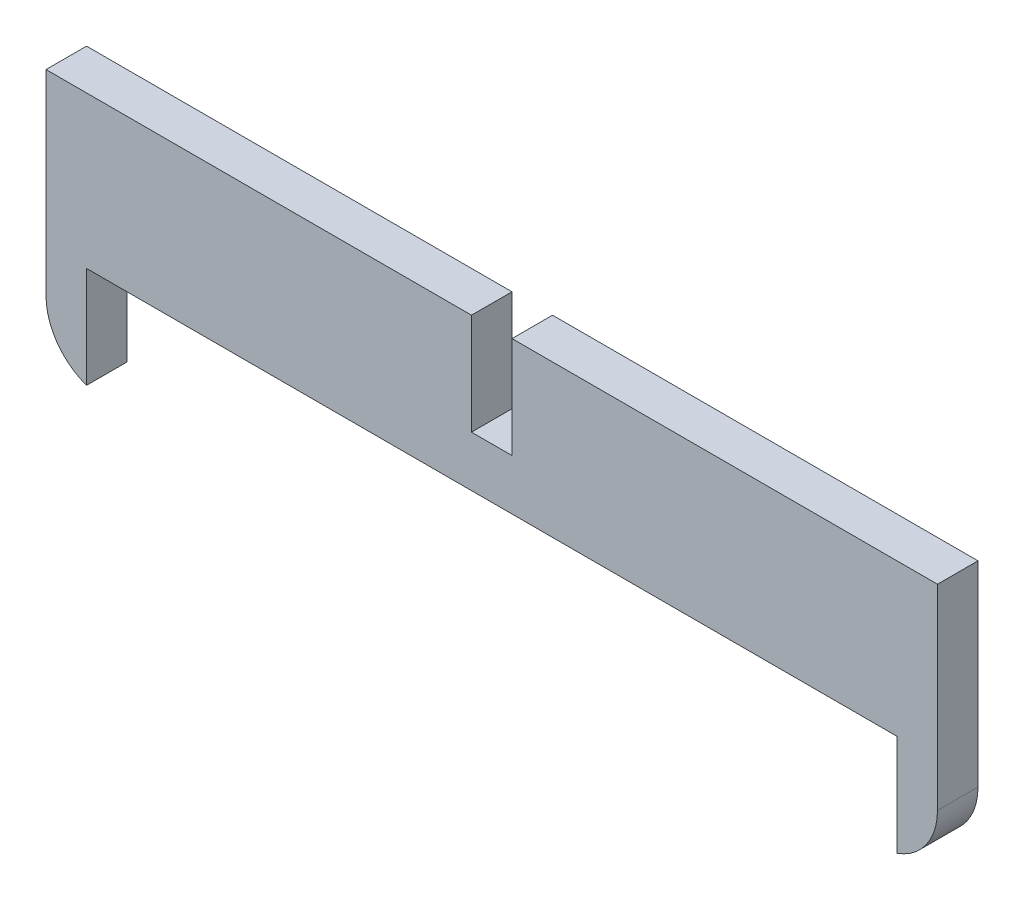
ISO-10303-21;
HEADER;
FILE_DESCRIPTION(('STEP AP214'),'2;1');
FILE_NAME('part.step','',(''),(''),'','','');
FILE_SCHEMA(('AUTOMOTIVE_DESIGN { 1 0 10303 214 1 1 1 1 }'));
ENDSEC;
DATA;
#1=APPLICATION_CONTEXT('core data for automotive mechanical design processes');
#2=APPLICATION_PROTOCOL_DEFINITION('international standard','automotive_design',2000,#1);
#3=PRODUCT_CONTEXT('',#1,'mechanical');
#4=PRODUCT('Part','Part','',(#3));
#5=PRODUCT_RELATED_PRODUCT_CATEGORY('part','',(#4));
#6=PRODUCT_DEFINITION_FORMATION('','',#4);
#7=PRODUCT_DEFINITION_CONTEXT('part definition',#1,'design');
#8=PRODUCT_DEFINITION('design','',#6,#7);
#9=PRODUCT_DEFINITION_SHAPE('','',#8);
#10=(LENGTH_UNIT() NAMED_UNIT(*) SI_UNIT(.MILLI.,.METRE.));
#11=(NAMED_UNIT(*) PLANE_ANGLE_UNIT() SI_UNIT($,.RADIAN.));
#12=(NAMED_UNIT(*) SI_UNIT($,.STERADIAN.) SOLID_ANGLE_UNIT());
#13=UNCERTAINTY_MEASURE_WITH_UNIT(LENGTH_MEASURE(1.E-05),#10,'distance_accuracy_value','');
#14=(GEOMETRIC_REPRESENTATION_CONTEXT(3) GLOBAL_UNCERTAINTY_ASSIGNED_CONTEXT((#13)) GLOBAL_UNIT_ASSIGNED_CONTEXT((#10,
#11,#12)) REPRESENTATION_CONTEXT('',''));
#15=CARTESIAN_POINT('',(0.,0.,0.));
#16=DIRECTION('',(0.,0.,1.));
#17=DIRECTION('',(1.,0.,0.));
#18=AXIS2_PLACEMENT_3D('',#15,#16,#17);
#19=CARTESIAN_POINT('',(-55.88,9.525,5.08));
#20=DIRECTION('',(0.,-1.,0.));
#21=DIRECTION('',(0.,0.,-1.));
#22=AXIS2_PLACEMENT_3D('',#19,#20,#21);
#23=PLANE('',#22);
#24=DIRECTION('',(-1.,0.,0.));
#25=VECTOR('',#24,1.);
#26=CARTESIAN_POINT('',(-55.88,9.525,0.));
#27=LINE('',#26,#25);
#28=CARTESIAN_POINT('',(55.88,9.525,0.));
#29=VERTEX_POINT('',#28);
#30=CARTESIAN_POINT('',(2.54,9.525,0.));
#31=VERTEX_POINT('',#30);
#32=EDGE_CURVE('E137',#29,#31,#27,.T.);
#33=ORIENTED_EDGE('',*,*,#32,.T.);
#34=DIRECTION('',(0.,0.,1.));
#35=VECTOR('',#34,1.);
#36=CARTESIAN_POINT('',(2.54,9.525,0.));
#37=LINE('',#36,#35);
#38=CARTESIAN_POINT('',(2.54,9.525,5.08));
#39=VERTEX_POINT('',#38);
#40=EDGE_CURVE('E121',#31,#39,#37,.T.);
#41=ORIENTED_EDGE('',*,*,#40,.T.);
#42=DIRECTION('',(-1.,0.,0.));
#43=VECTOR('',#42,1.);
#44=CARTESIAN_POINT('',(-55.88,9.525,5.08));
#45=LINE('',#44,#43);
#46=CARTESIAN_POINT('',(55.88,9.525,5.08));
#47=VERTEX_POINT('',#46);
#48=EDGE_CURVE('E211',#47,#39,#45,.T.);
#49=ORIENTED_EDGE('',*,*,#48,.F.);
#50=DIRECTION('',(0.,0.,-1.));
#51=VECTOR('',#50,1.);
#52=CARTESIAN_POINT('',(55.88,9.525,5.08));
#53=LINE('',#52,#51);
#54=EDGE_CURVE('E144',#47,#29,#53,.T.);
#55=ORIENTED_EDGE('',*,*,#54,.T.);
#56=EDGE_LOOP('',(#33,#41,#49,#55));
#57=FACE_BOUND('',#56,.T.);
#58=ADVANCED_FACE('F32',(#57),#23,.F.);
#59=CARTESIAN_POINT('',(-55.88,-9.525,5.08));
#60=DIRECTION('',(0.,1.,0.));
#61=DIRECTION('',(0.,0.,1.));
#62=AXIS2_PLACEMENT_3D('',#59,#60,#61);
#63=PLANE('',#62);
#64=DIRECTION('',(1.,0.,0.));
#65=VECTOR('',#64,1.);
#66=CARTESIAN_POINT('',(-55.88,-9.525,0.));
#67=LINE('',#66,#65);
#68=CARTESIAN_POINT('',(-50.8,-9.525,0.));
#69=VERTEX_POINT('',#68);
#70=CARTESIAN_POINT('',(50.8,-9.525,0.));
#71=VERTEX_POINT('',#70);
#72=EDGE_CURVE('E148',#69,#71,#67,.T.);
#73=ORIENTED_EDGE('',*,*,#72,.T.);
#74=DIRECTION('',(0.,0.,1.));
#75=VECTOR('',#74,1.);
#76=CARTESIAN_POINT('',(50.8,-9.525,5.08));
#77=LINE('',#76,#75);
#78=CARTESIAN_POINT('',(50.8,-9.525,5.08));
#79=VERTEX_POINT('',#78);
#80=EDGE_CURVE('E193',#71,#79,#77,.T.);
#81=ORIENTED_EDGE('',*,*,#80,.T.);
#82=DIRECTION('',(1.,0.,0.));
#83=VECTOR('',#82,1.);
#84=CARTESIAN_POINT('',(-55.88,-9.525,5.08));
#85=LINE('',#84,#83);
#86=CARTESIAN_POINT('',(-50.8,-9.525,5.08));
#87=VERTEX_POINT('',#86);
#88=EDGE_CURVE('E159',#87,#79,#85,.T.);
#89=ORIENTED_EDGE('',*,*,#88,.F.);
#90=DIRECTION('',(0.,0.,1.));
#91=VECTOR('',#90,1.);
#92=CARTESIAN_POINT('',(-50.8,-9.525,5.08));
#93=LINE('',#92,#91);
#94=EDGE_CURVE('E195',#69,#87,#93,.T.);
#95=ORIENTED_EDGE('',*,*,#94,.F.);
#96=EDGE_LOOP('',(#73,#81,#89,#95));
#97=FACE_BOUND('',#96,.T.);
#98=ADVANCED_FACE('F216',(#97),#63,.F.);
#99=CARTESIAN_POINT('',(55.88,-9.525,5.08));
#100=DIRECTION('',(-1.,0.,0.));
#101=DIRECTION('',(0.,0.,1.));
#102=AXIS2_PLACEMENT_3D('',#99,#100,#101);
#103=PLANE('',#102);
#104=DIRECTION('',(0.,1.,0.));
#105=VECTOR('',#104,1.);
#106=CARTESIAN_POINT('',(55.88,-9.525,5.08));
#107=LINE('',#106,#105);
#108=CARTESIAN_POINT('',(55.88,-15.0407951031447,5.08));
#109=VERTEX_POINT('',#108);
#110=EDGE_CURVE('E155',#109,#47,#107,.T.);
#111=ORIENTED_EDGE('',*,*,#110,.F.);
#112=DIRECTION('',(0.,0.,-1.));
#113=VECTOR('',#112,1.);
#114=CARTESIAN_POINT('',(55.88,-15.0407951031447,5.08));
#115=LINE('',#114,#113);
#116=CARTESIAN_POINT('',(55.88,-15.0407951031447,0.));
#117=VERTEX_POINT('',#116);
#118=EDGE_CURVE('E161',#109,#117,#115,.T.);
#119=ORIENTED_EDGE('',*,*,#118,.T.);
#120=DIRECTION('',(0.,1.,0.));
#121=VECTOR('',#120,1.);
#122=CARTESIAN_POINT('',(55.88,-9.525,0.));
#123=LINE('',#122,#121);
#124=EDGE_CURVE('E150',#117,#29,#123,.T.);
#125=ORIENTED_EDGE('',*,*,#124,.T.);
#126=ORIENTED_EDGE('',*,*,#54,.F.);
#127=EDGE_LOOP('',(#111,#119,#125,#126));
#128=FACE_BOUND('',#127,.T.);
#129=ADVANCED_FACE('F181',(#128),#103,.F.);
#130=CARTESIAN_POINT('',(-2.54,9.525,5.08));
#131=VERTEX_POINT('',#130);
#132=CARTESIAN_POINT('',(-55.88,9.525,5.08));
#133=VERTEX_POINT('',#132);
#134=EDGE_CURVE('E182',#131,#133,#45,.T.);
#135=ORIENTED_EDGE('',*,*,#134,.F.);
#136=DIRECTION('',(0.,0.,1.));
#137=VECTOR('',#136,1.);
#138=CARTESIAN_POINT('',(-2.54,9.525,0.));
#139=LINE('',#138,#137);
#140=CARTESIAN_POINT('',(-2.54,9.525,0.));
#141=VERTEX_POINT('',#140);
#142=EDGE_CURVE('E131',#141,#131,#139,.T.);
#143=ORIENTED_EDGE('',*,*,#142,.F.);
#144=CARTESIAN_POINT('',(-55.88,9.525,0.));
#145=VERTEX_POINT('',#144);
#146=EDGE_CURVE('E146',#141,#145,#27,.T.);
#147=ORIENTED_EDGE('',*,*,#146,.T.);
#148=DIRECTION('',(0.,0.,-1.));
#149=VECTOR('',#148,1.);
#150=CARTESIAN_POINT('',(-55.88,9.525,5.08));
#151=LINE('',#150,#149);
#152=EDGE_CURVE('E156',#133,#145,#151,.T.);
#153=ORIENTED_EDGE('',*,*,#152,.F.);
#154=EDGE_LOOP('',(#135,#143,#147,#153));
#155=FACE_BOUND('',#154,.T.);
#156=ADVANCED_FACE('F234',(#155),#23,.F.);
#157=CARTESIAN_POINT('',(-55.88,-9.525,5.08));
#158=DIRECTION('',(1.,0.,0.));
#159=DIRECTION('',(0.,0.,-1.));
#160=AXIS2_PLACEMENT_3D('',#157,#158,#159);
#161=PLANE('',#160);
#162=DIRECTION('',(0.,-1.,0.));
#163=VECTOR('',#162,1.);
#164=CARTESIAN_POINT('',(-55.88,-9.525,0.));
#165=LINE('',#164,#163);
#166=CARTESIAN_POINT('',(-55.88,-15.0407951031447,0.));
#167=VERTEX_POINT('',#166);
#168=EDGE_CURVE('E145',#145,#167,#165,.T.);
#169=ORIENTED_EDGE('',*,*,#168,.T.);
#170=DIRECTION('',(0.,0.,-1.));
#171=VECTOR('',#170,1.);
#172=CARTESIAN_POINT('',(-55.88,-15.0407951031447,5.08));
#173=LINE('',#172,#171);
#174=CARTESIAN_POINT('',(-55.88,-15.0407951031447,5.08));
#175=VERTEX_POINT('',#174);
#176=EDGE_CURVE('E11',#167,#175,#173,.F.);
#177=ORIENTED_EDGE('',*,*,#176,.T.);
#178=DIRECTION('',(0.,-1.,0.));
#179=VECTOR('',#178,1.);
#180=CARTESIAN_POINT('',(-55.88,-9.525,5.08));
#181=LINE('',#180,#179);
#182=EDGE_CURVE('E213',#133,#175,#181,.T.);
#183=ORIENTED_EDGE('',*,*,#182,.F.);
#184=ORIENTED_EDGE('',*,*,#152,.T.);
#185=EDGE_LOOP('',(#169,#177,#183,#184));
#186=FACE_BOUND('',#185,.T.);
#187=ADVANCED_FACE('F224',(#186),#161,.F.);
#188=CARTESIAN_POINT('',(0.,0.,5.08));
#189=DIRECTION('',(0.,0.,-1.));
#190=DIRECTION('',(-1.,0.,0.));
#191=AXIS2_PLACEMENT_3D('',#188,#189,#190);
#192=PLANE('',#191);
#193=ORIENTED_EDGE('',*,*,#48,.T.);
#194=DIRECTION('',(0.,1.,0.));
#195=VECTOR('',#194,1.);
#196=CARTESIAN_POINT('',(2.54,-3.17499999999998,5.08));
#197=LINE('',#196,#195);
#198=CARTESIAN_POINT('',(2.54,-3.17499999999998,5.08));
#199=VERTEX_POINT('',#198);
#200=EDGE_CURVE('E126',#199,#39,#197,.T.);
#201=ORIENTED_EDGE('',*,*,#200,.F.);
#202=DIRECTION('',(1.,0.,0.));
#203=VECTOR('',#202,1.);
#204=CARTESIAN_POINT('',(-2.54,-3.17499999999998,5.08));
#205=LINE('',#204,#203);
#206=CARTESIAN_POINT('',(-2.54,-3.17499999999998,5.08));
#207=VERTEX_POINT('',#206);
#208=EDGE_CURVE('E141',#207,#199,#205,.T.);
#209=ORIENTED_EDGE('',*,*,#208,.F.);
#210=DIRECTION('',(0.,-1.,0.));
#211=VECTOR('',#210,1.);
#212=CARTESIAN_POINT('',(-2.54,-3.17499999999998,5.08));
#213=LINE('',#212,#211);
#214=EDGE_CURVE('E231',#131,#207,#213,.T.);
#215=ORIENTED_EDGE('',*,*,#214,.F.);
#216=ORIENTED_EDGE('',*,*,#134,.T.);
#217=ORIENTED_EDGE('',*,*,#182,.T.);
#218=CARTESIAN_POINT('',(-48.26,-15.0407951031447,5.08));
#219=DIRECTION('',(0.,0.,-1.));
#220=DIRECTION('',(-1.,0.,0.));
#221=AXIS2_PLACEMENT_3D('',#218,#219,#220);
#222=CIRCLE('',#221,7.62);
#223=CARTESIAN_POINT('',(-50.8,-22.225,5.08));
#224=VERTEX_POINT('',#223);
#225=EDGE_CURVE('E168',#175,#224,#222,.F.);
#226=ORIENTED_EDGE('',*,*,#225,.T.);
#227=DIRECTION('',(0.,1.,0.));
#228=VECTOR('',#227,1.);
#229=CARTESIAN_POINT('',(-50.8,-22.225,5.08));
#230=LINE('',#229,#228);
#231=EDGE_CURVE('E203',#224,#87,#230,.T.);
#232=ORIENTED_EDGE('',*,*,#231,.T.);
#233=ORIENTED_EDGE('',*,*,#88,.T.);
#234=DIRECTION('',(0.,1.,0.));
#235=VECTOR('',#234,1.);
#236=CARTESIAN_POINT('',(50.8,-22.225,5.08));
#237=LINE('',#236,#235);
#238=CARTESIAN_POINT('',(50.8,-22.225,5.08));
#239=VERTEX_POINT('',#238);
#240=EDGE_CURVE('E175',#239,#79,#237,.T.);
#241=ORIENTED_EDGE('',*,*,#240,.F.);
#242=CARTESIAN_POINT('',(48.26,-15.0407951031447,5.08));
#243=DIRECTION('',(0.,0.,-1.));
#244=DIRECTION('',(-1.,0.,0.));
#245=AXIS2_PLACEMENT_3D('',#242,#243,#244);
#246=CIRCLE('',#245,7.62);
#247=EDGE_CURVE('E40',#239,#109,#246,.F.);
#248=ORIENTED_EDGE('',*,*,#247,.T.);
#249=ORIENTED_EDGE('',*,*,#110,.T.);
#250=EDGE_LOOP('',(#193,#201,#209,#215,#216,#217,#226,#232,#233,#241,#248,#249));
#251=FACE_BOUND('',#250,.T.);
#252=ADVANCED_FACE('F172',(#251),#192,.F.);
#253=CARTESIAN_POINT('',(0.,0.,0.));
#254=DIRECTION('',(0.,0.,-1.));
#255=DIRECTION('',(-1.,0.,0.));
#256=AXIS2_PLACEMENT_3D('',#253,#254,#255);
#257=PLANE('',#256);
#258=DIRECTION('',(0.,1.,0.));
#259=VECTOR('',#258,1.);
#260=CARTESIAN_POINT('',(2.54,-3.17499999999998,0.));
#261=LINE('',#260,#259);
#262=CARTESIAN_POINT('',(2.54,-3.17499999999998,0.));
#263=VERTEX_POINT('',#262);
#264=EDGE_CURVE('E124',#263,#31,#261,.T.);
#265=ORIENTED_EDGE('',*,*,#264,.T.);
#266=ORIENTED_EDGE('',*,*,#32,.F.);
#267=ORIENTED_EDGE('',*,*,#124,.F.);
#268=CARTESIAN_POINT('',(48.26,-15.0407951031447,0.));
#269=DIRECTION('',(0.,0.,-1.));
#270=DIRECTION('',(-1.,0.,0.));
#271=AXIS2_PLACEMENT_3D('',#268,#269,#270);
#272=CIRCLE('',#271,7.62);
#273=CARTESIAN_POINT('',(50.8,-22.225,0.));
#274=VERTEX_POINT('',#273);
#275=EDGE_CURVE('E166',#117,#274,#272,.T.);
#276=ORIENTED_EDGE('',*,*,#275,.T.);
#277=DIRECTION('',(0.,1.,0.));
#278=VECTOR('',#277,1.);
#279=CARTESIAN_POINT('',(50.8,-22.225,0.));
#280=LINE('',#279,#278);
#281=EDGE_CURVE('E189',#274,#71,#280,.T.);
#282=ORIENTED_EDGE('',*,*,#281,.T.);
#283=ORIENTED_EDGE('',*,*,#72,.F.);
#284=DIRECTION('',(0.,1.,0.));
#285=VECTOR('',#284,1.);
#286=CARTESIAN_POINT('',(-50.8,-22.225,0.));
#287=LINE('',#286,#285);
#288=CARTESIAN_POINT('',(-50.8,-22.225,0.));
#289=VERTEX_POINT('',#288);
#290=EDGE_CURVE('E208',#289,#69,#287,.T.);
#291=ORIENTED_EDGE('',*,*,#290,.F.);
#292=CARTESIAN_POINT('',(-48.26,-15.0407951031447,0.));
#293=DIRECTION('',(0.,0.,-1.));
#294=DIRECTION('',(-1.,0.,0.));
#295=AXIS2_PLACEMENT_3D('',#292,#293,#294);
#296=CIRCLE('',#295,7.62);
#297=EDGE_CURVE('E164',#289,#167,#296,.T.);
#298=ORIENTED_EDGE('',*,*,#297,.T.);
#299=ORIENTED_EDGE('',*,*,#168,.F.);
#300=ORIENTED_EDGE('',*,*,#146,.F.);
#301=DIRECTION('',(0.,-1.,0.));
#302=VECTOR('',#301,1.);
#303=CARTESIAN_POINT('',(-2.54,-3.17499999999998,0.));
#304=LINE('',#303,#302);
#305=CARTESIAN_POINT('',(-2.54,-3.17499999999998,0.));
#306=VERTEX_POINT('',#305);
#307=EDGE_CURVE('E140',#141,#306,#304,.T.);
#308=ORIENTED_EDGE('',*,*,#307,.T.);
#309=DIRECTION('',(1.,0.,0.));
#310=VECTOR('',#309,1.);
#311=CARTESIAN_POINT('',(-2.54,-3.17499999999998,0.));
#312=LINE('',#311,#310);
#313=EDGE_CURVE('E47',#306,#263,#312,.T.);
#314=ORIENTED_EDGE('',*,*,#313,.T.);
#315=EDGE_LOOP('',(#265,#266,#267,#276,#282,#283,#291,#298,#299,#300,#308,#314));
#316=FACE_BOUND('',#315,.T.);
#317=ADVANCED_FACE('F135',(#316),#257,.T.);
#318=CARTESIAN_POINT('',(-50.8,-22.225,5.08));
#319=DIRECTION('',(-1.,0.,0.));
#320=DIRECTION('',(0.,0.,1.));
#321=AXIS2_PLACEMENT_3D('',#318,#319,#320);
#322=PLANE('',#321);
#323=ORIENTED_EDGE('',*,*,#94,.T.);
#324=ORIENTED_EDGE('',*,*,#231,.F.);
#325=DIRECTION('',(0.,0.,1.));
#326=VECTOR('',#325,1.);
#327=CARTESIAN_POINT('',(-50.8,-22.225,5.08));
#328=LINE('',#327,#326);
#329=EDGE_CURVE('E200',#289,#224,#328,.T.);
#330=ORIENTED_EDGE('',*,*,#329,.F.);
#331=ORIENTED_EDGE('',*,*,#290,.T.);
#332=EDGE_LOOP('',(#323,#324,#330,#331));
#333=FACE_BOUND('',#332,.T.);
#334=ADVANCED_FACE('F218',(#333),#322,.F.);
#335=CARTESIAN_POINT('',(50.8,-22.225,5.08));
#336=DIRECTION('',(-1.,0.,0.));
#337=DIRECTION('',(0.,0.,1.));
#338=AXIS2_PLACEMENT_3D('',#335,#336,#337);
#339=PLANE('',#338);
#340=ORIENTED_EDGE('',*,*,#80,.F.);
#341=ORIENTED_EDGE('',*,*,#281,.F.);
#342=DIRECTION('',(0.,0.,1.));
#343=VECTOR('',#342,1.);
#344=CARTESIAN_POINT('',(50.8,-22.225,5.08));
#345=LINE('',#344,#343);
#346=EDGE_CURVE('E185',#274,#239,#345,.T.);
#347=ORIENTED_EDGE('',*,*,#346,.T.);
#348=ORIENTED_EDGE('',*,*,#240,.T.);
#349=EDGE_LOOP('',(#340,#341,#347,#348));
#350=FACE_BOUND('',#349,.T.);
#351=ADVANCED_FACE('F192',(#350),#339,.T.);
#352=CARTESIAN_POINT('',(48.26,-15.0407951031447,0.));
#353=DIRECTION('',(0.,0.,-1.));
#354=DIRECTION('',(-1.,0.,0.));
#355=AXIS2_PLACEMENT_3D('',#352,#353,#354);
#356=CYLINDRICAL_SURFACE('',#355,7.62);
#357=ORIENTED_EDGE('',*,*,#247,.F.);
#358=ORIENTED_EDGE('',*,*,#346,.F.);
#359=ORIENTED_EDGE('',*,*,#275,.F.);
#360=ORIENTED_EDGE('',*,*,#118,.F.);
#361=EDGE_LOOP('',(#357,#358,#359,#360));
#362=FACE_BOUND('',#361,.T.);
#363=ADVANCED_FACE('F184',(#362),#356,.T.);
#364=CARTESIAN_POINT('',(-48.26,-15.0407951031447,0.));
#365=DIRECTION('',(0.,0.,-1.));
#366=DIRECTION('',(-1.,0.,0.));
#367=AXIS2_PLACEMENT_3D('',#364,#365,#366);
#368=CYLINDRICAL_SURFACE('',#367,7.62);
#369=ORIENTED_EDGE('',*,*,#225,.F.);
#370=ORIENTED_EDGE('',*,*,#176,.F.);
#371=ORIENTED_EDGE('',*,*,#297,.F.);
#372=ORIENTED_EDGE('',*,*,#329,.T.);
#373=EDGE_LOOP('',(#369,#370,#371,#372));
#374=FACE_BOUND('',#373,.T.);
#375=ADVANCED_FACE('F34',(#374),#368,.T.);
#376=CARTESIAN_POINT('',(2.54,-3.17499999999998,0.));
#377=DIRECTION('',(1.,0.,0.));
#378=DIRECTION('',(0.,0.,-1.));
#379=AXIS2_PLACEMENT_3D('',#376,#377,#378);
#380=PLANE('',#379);
#381=ORIENTED_EDGE('',*,*,#200,.T.);
#382=ORIENTED_EDGE('',*,*,#40,.F.);
#383=ORIENTED_EDGE('',*,*,#264,.F.);
#384=DIRECTION('',(0.,0.,1.));
#385=VECTOR('',#384,1.);
#386=CARTESIAN_POINT('',(2.54,-3.17499999999998,0.));
#387=LINE('',#386,#385);
#388=EDGE_CURVE('E243',#263,#199,#387,.T.);
#389=ORIENTED_EDGE('',*,*,#388,.T.);
#390=EDGE_LOOP('',(#381,#382,#383,#389));
#391=FACE_BOUND('',#390,.T.);
#392=ADVANCED_FACE('F123',(#391),#380,.F.);
#393=CARTESIAN_POINT('',(-2.54,-3.17499999999998,0.));
#394=DIRECTION('',(0.,-1.,0.));
#395=DIRECTION('',(0.,0.,-1.));
#396=AXIS2_PLACEMENT_3D('',#393,#394,#395);
#397=PLANE('',#396);
#398=ORIENTED_EDGE('',*,*,#208,.T.);
#399=ORIENTED_EDGE('',*,*,#388,.F.);
#400=ORIENTED_EDGE('',*,*,#313,.F.);
#401=DIRECTION('',(0.,0.,1.));
#402=VECTOR('',#401,1.);
#403=CARTESIAN_POINT('',(-2.54,-3.17499999999998,0.));
#404=LINE('',#403,#402);
#405=EDGE_CURVE('E245',#306,#207,#404,.T.);
#406=ORIENTED_EDGE('',*,*,#405,.T.);
#407=EDGE_LOOP('',(#398,#399,#400,#406));
#408=FACE_BOUND('',#407,.T.);
#409=ADVANCED_FACE('F248',(#408),#397,.F.);
#410=CARTESIAN_POINT('',(-2.54,-3.17499999999998,0.));
#411=DIRECTION('',(-1.,0.,0.));
#412=DIRECTION('',(0.,0.,1.));
#413=AXIS2_PLACEMENT_3D('',#410,#411,#412);
#414=PLANE('',#413);
#415=ORIENTED_EDGE('',*,*,#214,.T.);
#416=ORIENTED_EDGE('',*,*,#405,.F.);
#417=ORIENTED_EDGE('',*,*,#307,.F.);
#418=ORIENTED_EDGE('',*,*,#142,.T.);
#419=EDGE_LOOP('',(#415,#416,#417,#418));
#420=FACE_BOUND('',#419,.T.);
#421=ADVANCED_FACE('F247',(#420),#414,.F.);
#422=CLOSED_SHELL('',(#58,#98,#129,#156,#187,#252,#317,#334,#351,#363,#375,#392,#409,#421));
#423=MANIFOLD_SOLID_BREP('B2',#422);
#424=ADVANCED_BREP_SHAPE_REPRESENTATION('',(#18,#423),#14);
#425=SHAPE_DEFINITION_REPRESENTATION(#9,#424);
ENDSEC;
END-ISO-10303-21;
